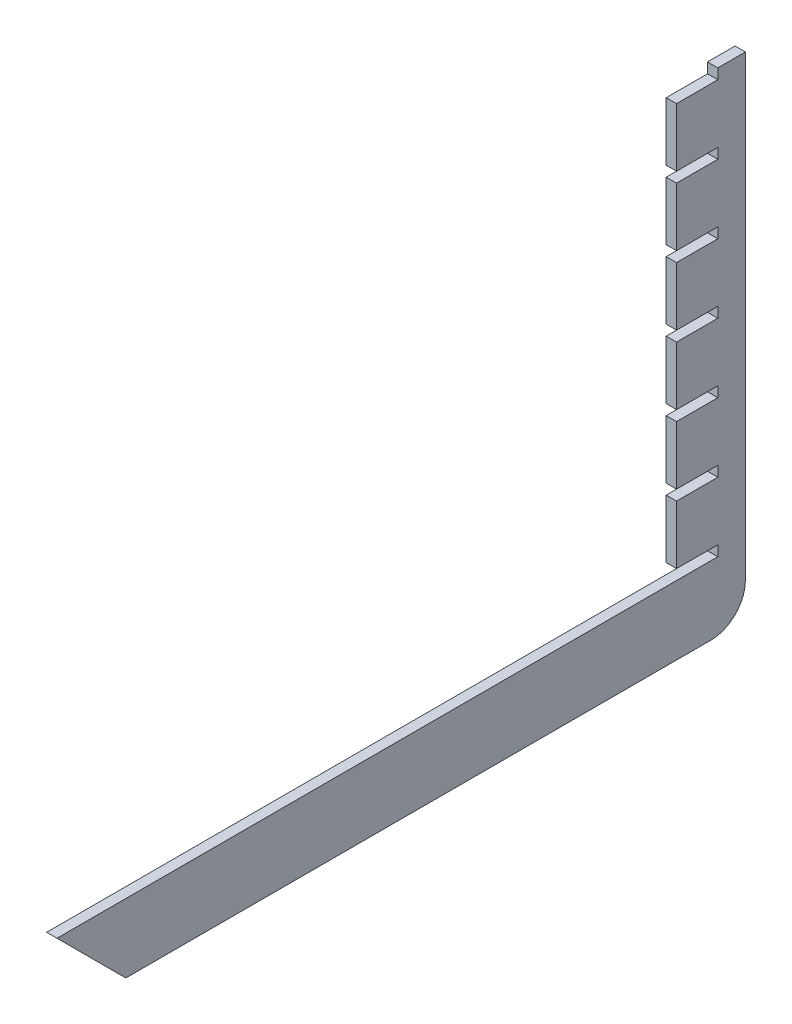
ISO-10303-21;
HEADER;
FILE_DESCRIPTION(('STEP AP214'),'2;1');
FILE_NAME('part.step','',(''),(''),'','','');
FILE_SCHEMA(('AUTOMOTIVE_DESIGN { 1 0 10303 214 1 1 1 1 }'));
ENDSEC;
DATA;
#1=APPLICATION_CONTEXT('core data for automotive mechanical design processes');
#2=APPLICATION_PROTOCOL_DEFINITION('international standard','automotive_design',2000,#1);
#3=PRODUCT_CONTEXT('',#1,'mechanical');
#4=PRODUCT('Part','Part','',(#3));
#5=PRODUCT_RELATED_PRODUCT_CATEGORY('part','',(#4));
#6=PRODUCT_DEFINITION_FORMATION('','',#4);
#7=PRODUCT_DEFINITION_CONTEXT('part definition',#1,'design');
#8=PRODUCT_DEFINITION('design','',#6,#7);
#9=PRODUCT_DEFINITION_SHAPE('','',#8);
#10=(LENGTH_UNIT() NAMED_UNIT(*) SI_UNIT(.MILLI.,.METRE.));
#11=(NAMED_UNIT(*) PLANE_ANGLE_UNIT() SI_UNIT($,.RADIAN.));
#12=(NAMED_UNIT(*) SI_UNIT($,.STERADIAN.) SOLID_ANGLE_UNIT());
#13=UNCERTAINTY_MEASURE_WITH_UNIT(LENGTH_MEASURE(1.E-05),#10,'distance_accuracy_value','');
#14=(GEOMETRIC_REPRESENTATION_CONTEXT(3) GLOBAL_UNCERTAINTY_ASSIGNED_CONTEXT((#13)) GLOBAL_UNIT_ASSIGNED_CONTEXT((#10,
#11,#12)) REPRESENTATION_CONTEXT('',''));
#15=CARTESIAN_POINT('',(0.,0.,0.));
#16=DIRECTION('',(0.,0.,1.));
#17=DIRECTION('',(1.,0.,0.));
#18=AXIS2_PLACEMENT_3D('',#15,#16,#17);
#19=CARTESIAN_POINT('',(3.,0.,0.));
#20=DIRECTION('',(0.,0.,-1.));
#21=DIRECTION('',(-1.,0.,0.));
#22=AXIS2_PLACEMENT_3D('',#19,#20,#21);
#23=PLANE('',#22);
#24=DIRECTION('',(0.,-1.,0.));
#25=VECTOR('',#24,1.);
#26=CARTESIAN_POINT('',(0.,0.,0.));
#27=LINE('',#26,#25);
#28=CARTESIAN_POINT('',(0.,40.,0.));
#29=VERTEX_POINT('',#28);
#30=CARTESIAN_POINT('',(0.,23.,0.));
#31=VERTEX_POINT('',#30);
#32=EDGE_CURVE('E525',#29,#31,#27,.T.);
#33=ORIENTED_EDGE('',*,*,#32,.T.);
#34=DIRECTION('',(1.,0.,0.));
#35=VECTOR('',#34,1.);
#36=CARTESIAN_POINT('',(0.,23.,0.));
#37=LINE('',#36,#35);
#38=CARTESIAN_POINT('',(3.,23.,0.));
#39=VERTEX_POINT('',#38);
#40=EDGE_CURVE('E302',#31,#39,#37,.T.);
#41=ORIENTED_EDGE('',*,*,#40,.T.);
#42=DIRECTION('',(0.,-1.,0.));
#43=VECTOR('',#42,1.);
#44=CARTESIAN_POINT('',(3.,0.,0.));
#45=LINE('',#44,#43);
#46=CARTESIAN_POINT('',(3.,40.,0.));
#47=VERTEX_POINT('',#46);
#48=EDGE_CURVE('E512',#47,#39,#45,.T.);
#49=ORIENTED_EDGE('',*,*,#48,.F.);
#50=DIRECTION('',(1.,0.,0.));
#51=VECTOR('',#50,1.);
#52=CARTESIAN_POINT('',(0.,40.,0.));
#53=LINE('',#52,#51);
#54=EDGE_CURVE('E328',#29,#47,#53,.T.);
#55=ORIENTED_EDGE('',*,*,#54,.F.);
#56=EDGE_LOOP('',(#33,#41,#49,#55));
#57=FACE_BOUND('',#56,.T.);
#58=ADVANCED_FACE('F42',(#57),#23,.F.);
#59=CARTESIAN_POINT('',(0.,60.,0.));
#60=VERTEX_POINT('',#59);
#61=CARTESIAN_POINT('',(0.,43.,0.));
#62=VERTEX_POINT('',#61);
#63=EDGE_CURVE('E564',#60,#62,#27,.T.);
#64=ORIENTED_EDGE('',*,*,#63,.T.);
#65=DIRECTION('',(1.,0.,0.));
#66=VECTOR('',#65,1.);
#67=CARTESIAN_POINT('',(0.,43.,0.));
#68=LINE('',#67,#66);
#69=CARTESIAN_POINT('',(3.,43.,0.));
#70=VERTEX_POINT('',#69);
#71=EDGE_CURVE('E296',#62,#70,#68,.T.);
#72=ORIENTED_EDGE('',*,*,#71,.T.);
#73=CARTESIAN_POINT('',(3.,60.,0.));
#74=VERTEX_POINT('',#73);
#75=EDGE_CURVE('E551',#74,#70,#45,.T.);
#76=ORIENTED_EDGE('',*,*,#75,.F.);
#77=DIRECTION('',(1.,0.,0.));
#78=VECTOR('',#77,1.);
#79=CARTESIAN_POINT('',(0.,60.,0.));
#80=LINE('',#79,#78);
#81=EDGE_CURVE('E364',#60,#74,#80,.T.);
#82=ORIENTED_EDGE('',*,*,#81,.F.);
#83=EDGE_LOOP('',(#64,#72,#76,#82));
#84=FACE_BOUND('',#83,.T.);
#85=ADVANCED_FACE('F617',(#84),#23,.F.);
#86=CARTESIAN_POINT('',(0.,80.,0.));
#87=VERTEX_POINT('',#86);
#88=CARTESIAN_POINT('',(0.,63.,0.));
#89=VERTEX_POINT('',#88);
#90=EDGE_CURVE('E561',#87,#89,#27,.T.);
#91=ORIENTED_EDGE('',*,*,#90,.T.);
#92=DIRECTION('',(1.,0.,0.));
#93=VECTOR('',#92,1.);
#94=CARTESIAN_POINT('',(0.,63.,0.));
#95=LINE('',#94,#93);
#96=CARTESIAN_POINT('',(3.,63.,0.));
#97=VERTEX_POINT('',#96);
#98=EDGE_CURVE('E334',#89,#97,#95,.T.);
#99=ORIENTED_EDGE('',*,*,#98,.T.);
#100=CARTESIAN_POINT('',(3.,80.,0.));
#101=VERTEX_POINT('',#100);
#102=EDGE_CURVE('E548',#101,#97,#45,.T.);
#103=ORIENTED_EDGE('',*,*,#102,.F.);
#104=DIRECTION('',(1.,0.,0.));
#105=VECTOR('',#104,1.);
#106=CARTESIAN_POINT('',(0.,80.,0.));
#107=LINE('',#106,#105);
#108=EDGE_CURVE('E400',#87,#101,#107,.T.);
#109=ORIENTED_EDGE('',*,*,#108,.F.);
#110=EDGE_LOOP('',(#91,#99,#103,#109));
#111=FACE_BOUND('',#110,.T.);
#112=ADVANCED_FACE('F632',(#111),#23,.F.);
#113=CARTESIAN_POINT('',(0.,100.,0.));
#114=VERTEX_POINT('',#113);
#115=CARTESIAN_POINT('',(0.,83.,0.));
#116=VERTEX_POINT('',#115);
#117=EDGE_CURVE('E558',#114,#116,#27,.T.);
#118=ORIENTED_EDGE('',*,*,#117,.T.);
#119=DIRECTION('',(1.,0.,0.));
#120=VECTOR('',#119,1.);
#121=CARTESIAN_POINT('',(0.,83.,0.));
#122=LINE('',#121,#120);
#123=CARTESIAN_POINT('',(3.,83.,0.));
#124=VERTEX_POINT('',#123);
#125=EDGE_CURVE('E370',#116,#124,#122,.T.);
#126=ORIENTED_EDGE('',*,*,#125,.T.);
#127=CARTESIAN_POINT('',(3.,100.,0.));
#128=VERTEX_POINT('',#127);
#129=EDGE_CURVE('E545',#128,#124,#45,.T.);
#130=ORIENTED_EDGE('',*,*,#129,.F.);
#131=DIRECTION('',(1.,0.,0.));
#132=VECTOR('',#131,1.);
#133=CARTESIAN_POINT('',(0.,100.,0.));
#134=LINE('',#133,#132);
#135=EDGE_CURVE('E436',#114,#128,#134,.T.);
#136=ORIENTED_EDGE('',*,*,#135,.F.);
#137=EDGE_LOOP('',(#118,#126,#130,#136));
#138=FACE_BOUND('',#137,.T.);
#139=ADVANCED_FACE('F647',(#138),#23,.F.);
#140=CARTESIAN_POINT('',(0.,120.,0.));
#141=VERTEX_POINT('',#140);
#142=CARTESIAN_POINT('',(0.,103.,0.));
#143=VERTEX_POINT('',#142);
#144=EDGE_CURVE('E526',#141,#143,#27,.T.);
#145=ORIENTED_EDGE('',*,*,#144,.T.);
#146=DIRECTION('',(1.,0.,0.));
#147=VECTOR('',#146,1.);
#148=CARTESIAN_POINT('',(0.,103.,0.));
#149=LINE('',#148,#147);
#150=CARTESIAN_POINT('',(3.,103.,0.));
#151=VERTEX_POINT('',#150);
#152=EDGE_CURVE('E406',#143,#151,#149,.T.);
#153=ORIENTED_EDGE('',*,*,#152,.T.);
#154=CARTESIAN_POINT('',(3.,120.,0.));
#155=VERTEX_POINT('',#154);
#156=EDGE_CURVE('E514',#155,#151,#45,.T.);
#157=ORIENTED_EDGE('',*,*,#156,.F.);
#158=DIRECTION('',(1.,0.,0.));
#159=VECTOR('',#158,1.);
#160=CARTESIAN_POINT('',(0.,120.,0.));
#161=LINE('',#160,#159);
#162=EDGE_CURVE('E468',#141,#155,#161,.T.);
#163=ORIENTED_EDGE('',*,*,#162,.F.);
#164=EDGE_LOOP('',(#145,#153,#157,#163));
#165=FACE_BOUND('',#164,.T.);
#166=ADVANCED_FACE('F662',(#165),#23,.F.);
#167=CARTESIAN_POINT('',(3.,20.,0.));
#168=VERTEX_POINT('',#167);
#169=CARTESIAN_POINT('',(3.,3.,0.));
#170=VERTEX_POINT('',#169);
#171=EDGE_CURVE('E509',#168,#170,#45,.T.);
#172=ORIENTED_EDGE('',*,*,#171,.F.);
#173=DIRECTION('',(1.,0.,0.));
#174=VECTOR('',#173,1.);
#175=CARTESIAN_POINT('',(0.,20.,0.));
#176=LINE('',#175,#174);
#177=CARTESIAN_POINT('',(0.,20.,0.));
#178=VERTEX_POINT('',#177);
#179=EDGE_CURVE('E290',#178,#168,#176,.T.);
#180=ORIENTED_EDGE('',*,*,#179,.F.);
#181=CARTESIAN_POINT('',(0.,3.,0.));
#182=VERTEX_POINT('',#181);
#183=EDGE_CURVE('E502',#178,#182,#27,.T.);
#184=ORIENTED_EDGE('',*,*,#183,.T.);
#185=DIRECTION('',(1.,0.,0.));
#186=VECTOR('',#185,1.);
#187=CARTESIAN_POINT('',(0.,3.,0.));
#188=LINE('',#187,#186);
#189=EDGE_CURVE('E498',#182,#170,#188,.T.);
#190=ORIENTED_EDGE('',*,*,#189,.T.);
#191=EDGE_LOOP('',(#172,#180,#184,#190));
#192=FACE_BOUND('',#191,.T.);
#193=ADVANCED_FACE('F589',(#192),#23,.F.);
#194=CARTESIAN_POINT('',(3.,0.,-20.));
#195=DIRECTION('',(0.,0.,1.));
#196=DIRECTION('',(1.,0.,0.));
#197=AXIS2_PLACEMENT_3D('',#194,#195,#196);
#198=PLANE('',#197);
#199=DIRECTION('',(0.,1.,0.));
#200=VECTOR('',#199,1.);
#201=CARTESIAN_POINT('',(3.,0.,-20.));
#202=LINE('',#201,#200);
#203=CARTESIAN_POINT('',(3.,-10.,-20.));
#204=VERTEX_POINT('',#203);
#205=CARTESIAN_POINT('',(3.,123.,-20.));
#206=VERTEX_POINT('',#205);
#207=EDGE_CURVE('E515',#204,#206,#202,.T.);
#208=ORIENTED_EDGE('',*,*,#207,.F.);
#209=DIRECTION('',(-1.,0.,0.));
#210=VECTOR('',#209,1.);
#211=CARTESIAN_POINT('',(0.,-10.,-20.));
#212=LINE('',#211,#210);
#213=CARTESIAN_POINT('',(0.,-10.,-20.));
#214=VERTEX_POINT('',#213);
#215=EDGE_CURVE('E536',#204,#214,#212,.T.);
#216=ORIENTED_EDGE('',*,*,#215,.T.);
#217=DIRECTION('',(0.,1.,0.));
#218=VECTOR('',#217,1.);
#219=CARTESIAN_POINT('',(0.,0.,-20.));
#220=LINE('',#219,#218);
#221=CARTESIAN_POINT('',(0.,123.,-20.));
#222=VERTEX_POINT('',#221);
#223=EDGE_CURVE('E527',#214,#222,#220,.T.);
#224=ORIENTED_EDGE('',*,*,#223,.T.);
#225=DIRECTION('',(-1.,0.,0.));
#226=VECTOR('',#225,1.);
#227=CARTESIAN_POINT('',(3.,123.,-20.));
#228=LINE('',#227,#226);
#229=EDGE_CURVE('E522',#206,#222,#228,.T.);
#230=ORIENTED_EDGE('',*,*,#229,.F.);
#231=EDGE_LOOP('',(#208,#216,#224,#230));
#232=FACE_BOUND('',#231,.T.);
#233=ADVANCED_FACE('F678',(#232),#198,.F.);
#234=CARTESIAN_POINT('',(3.,123.,0.));
#235=DIRECTION('',(0.,-1.,0.));
#236=DIRECTION('',(0.,0.,-1.));
#237=AXIS2_PLACEMENT_3D('',#234,#235,#236);
#238=PLANE('',#237);
#239=DIRECTION('',(0.,0.,1.));
#240=VECTOR('',#239,1.);
#241=CARTESIAN_POINT('',(0.,123.,0.));
#242=LINE('',#241,#240);
#243=CARTESIAN_POINT('',(0.,123.,-12.));
#244=VERTEX_POINT('',#243);
#245=EDGE_CURVE('E513',#222,#244,#242,.T.);
#246=ORIENTED_EDGE('',*,*,#245,.T.);
#247=DIRECTION('',(1.,0.,0.));
#248=VECTOR('',#247,1.);
#249=CARTESIAN_POINT('',(0.,123.,-12.));
#250=LINE('',#249,#248);
#251=CARTESIAN_POINT('',(3.,123.,-12.));
#252=VERTEX_POINT('',#251);
#253=EDGE_CURVE('E442',#244,#252,#250,.T.);
#254=ORIENTED_EDGE('',*,*,#253,.T.);
#255=DIRECTION('',(0.,0.,1.));
#256=VECTOR('',#255,1.);
#257=CARTESIAN_POINT('',(3.,123.,0.));
#258=LINE('',#257,#256);
#259=EDGE_CURVE('E518',#206,#252,#258,.T.);
#260=ORIENTED_EDGE('',*,*,#259,.F.);
#261=ORIENTED_EDGE('',*,*,#229,.T.);
#262=EDGE_LOOP('',(#246,#254,#260,#261));
#263=FACE_BOUND('',#262,.T.);
#264=ADVANCED_FACE('F673',(#263),#238,.F.);
#265=CARTESIAN_POINT('',(3.,0.,0.));
#266=DIRECTION('',(-1.,0.,0.));
#267=DIRECTION('',(0.,0.,1.));
#268=AXIS2_PLACEMENT_3D('',#265,#266,#267);
#269=PLANE('',#268);
#270=DIRECTION('',(0.,0.,-1.));
#271=VECTOR('',#270,1.);
#272=CARTESIAN_POINT('',(3.,-20.,-20.));
#273=LINE('',#272,#271);
#274=CARTESIAN_POINT('',(3.,-20.,160.));
#275=VERTEX_POINT('',#274);
#276=CARTESIAN_POINT('',(3.,-20.,-10.));
#277=VERTEX_POINT('',#276);
#278=EDGE_CURVE('E255',#275,#277,#273,.T.);
#279=ORIENTED_EDGE('',*,*,#278,.T.);
#280=CARTESIAN_POINT('',(3.,-10.,-10.));
#281=DIRECTION('',(-1.,0.,0.));
#282=DIRECTION('',(0.,0.,1.));
#283=AXIS2_PLACEMENT_3D('',#280,#281,#282);
#284=CIRCLE('',#283,10.);
#285=EDGE_CURVE('E11',#277,#204,#284,.F.);
#286=ORIENTED_EDGE('',*,*,#285,.T.);
#287=ORIENTED_EDGE('',*,*,#207,.T.);
#288=ORIENTED_EDGE('',*,*,#259,.T.);
#289=DIRECTION('',(0.,1.,0.));
#290=VECTOR('',#289,1.);
#291=CARTESIAN_POINT('',(3.,120.,-12.));
#292=LINE('',#291,#290);
#293=CARTESIAN_POINT('',(3.,120.,-12.));
#294=VERTEX_POINT('',#293);
#295=EDGE_CURVE('E464',#294,#252,#292,.T.);
#296=ORIENTED_EDGE('',*,*,#295,.F.);
#297=DIRECTION('',(0.,0.,-1.));
#298=VECTOR('',#297,1.);
#299=CARTESIAN_POINT('',(3.,120.,0.));
#300=LINE('',#299,#298);
#301=EDGE_CURVE('E275',#155,#294,#300,.T.);
#302=ORIENTED_EDGE('',*,*,#301,.F.);
#303=ORIENTED_EDGE('',*,*,#156,.T.);
#304=DIRECTION('',(0.,0.,1.));
#305=VECTOR('',#304,1.);
#306=CARTESIAN_POINT('',(3.,103.,0.));
#307=LINE('',#306,#305);
#308=CARTESIAN_POINT('',(3.,103.,-12.));
#309=VERTEX_POINT('',#308);
#310=EDGE_CURVE('E428',#309,#151,#307,.T.);
#311=ORIENTED_EDGE('',*,*,#310,.F.);
#312=DIRECTION('',(0.,1.,0.));
#313=VECTOR('',#312,1.);
#314=CARTESIAN_POINT('',(3.,100.,-12.));
#315=LINE('',#314,#313);
#316=CARTESIAN_POINT('',(3.,100.,-12.));
#317=VERTEX_POINT('',#316);
#318=EDGE_CURVE('E441',#317,#309,#315,.T.);
#319=ORIENTED_EDGE('',*,*,#318,.F.);
#320=DIRECTION('',(0.,0.,-1.));
#321=VECTOR('',#320,1.);
#322=CARTESIAN_POINT('',(3.,100.,0.));
#323=LINE('',#322,#321);
#324=EDGE_CURVE('E437',#128,#317,#323,.T.);
#325=ORIENTED_EDGE('',*,*,#324,.F.);
#326=ORIENTED_EDGE('',*,*,#129,.T.);
#327=DIRECTION('',(0.,0.,1.));
#328=VECTOR('',#327,1.);
#329=CARTESIAN_POINT('',(3.,83.,0.));
#330=LINE('',#329,#328);
#331=CARTESIAN_POINT('',(3.,83.,-12.));
#332=VERTEX_POINT('',#331);
#333=EDGE_CURVE('E392',#332,#124,#330,.T.);
#334=ORIENTED_EDGE('',*,*,#333,.F.);
#335=DIRECTION('',(0.,1.,0.));
#336=VECTOR('',#335,1.);
#337=CARTESIAN_POINT('',(3.,80.,-12.));
#338=LINE('',#337,#336);
#339=CARTESIAN_POINT('',(3.,80.,-12.));
#340=VERTEX_POINT('',#339);
#341=EDGE_CURVE('E405',#340,#332,#338,.T.);
#342=ORIENTED_EDGE('',*,*,#341,.F.);
#343=DIRECTION('',(0.,0.,-1.));
#344=VECTOR('',#343,1.);
#345=CARTESIAN_POINT('',(3.,80.,0.));
#346=LINE('',#345,#344);
#347=EDGE_CURVE('E401',#101,#340,#346,.T.);
#348=ORIENTED_EDGE('',*,*,#347,.F.);
#349=ORIENTED_EDGE('',*,*,#102,.T.);
#350=DIRECTION('',(0.,0.,1.));
#351=VECTOR('',#350,1.);
#352=CARTESIAN_POINT('',(3.,63.,0.));
#353=LINE('',#352,#351);
#354=CARTESIAN_POINT('',(3.,63.,-12.));
#355=VERTEX_POINT('',#354);
#356=EDGE_CURVE('E356',#355,#97,#353,.T.);
#357=ORIENTED_EDGE('',*,*,#356,.F.);
#358=DIRECTION('',(0.,1.,0.));
#359=VECTOR('',#358,1.);
#360=CARTESIAN_POINT('',(3.,60.,-12.));
#361=LINE('',#360,#359);
#362=CARTESIAN_POINT('',(3.,60.,-12.));
#363=VERTEX_POINT('',#362);
#364=EDGE_CURVE('E369',#363,#355,#361,.T.);
#365=ORIENTED_EDGE('',*,*,#364,.F.);
#366=DIRECTION('',(0.,0.,-1.));
#367=VECTOR('',#366,1.);
#368=CARTESIAN_POINT('',(3.,60.,0.));
#369=LINE('',#368,#367);
#370=EDGE_CURVE('E365',#74,#363,#369,.T.);
#371=ORIENTED_EDGE('',*,*,#370,.F.);
#372=ORIENTED_EDGE('',*,*,#75,.T.);
#373=DIRECTION('',(0.,0.,1.));
#374=VECTOR('',#373,1.);
#375=CARTESIAN_POINT('',(3.,43.,0.));
#376=LINE('',#375,#374);
#377=CARTESIAN_POINT('',(3.,43.,-12.));
#378=VERTEX_POINT('',#377);
#379=EDGE_CURVE('E320',#378,#70,#376,.T.);
#380=ORIENTED_EDGE('',*,*,#379,.F.);
#381=DIRECTION('',(0.,1.,0.));
#382=VECTOR('',#381,1.);
#383=CARTESIAN_POINT('',(3.,40.,-12.));
#384=LINE('',#383,#382);
#385=CARTESIAN_POINT('',(3.,40.,-12.));
#386=VERTEX_POINT('',#385);
#387=EDGE_CURVE('E333',#386,#378,#384,.T.);
#388=ORIENTED_EDGE('',*,*,#387,.F.);
#389=DIRECTION('',(0.,0.,-1.));
#390=VECTOR('',#389,1.);
#391=CARTESIAN_POINT('',(3.,40.,0.));
#392=LINE('',#391,#390);
#393=EDGE_CURVE('E329',#47,#386,#392,.T.);
#394=ORIENTED_EDGE('',*,*,#393,.F.);
#395=ORIENTED_EDGE('',*,*,#48,.T.);
#396=DIRECTION('',(0.,0.,1.));
#397=VECTOR('',#396,1.);
#398=CARTESIAN_POINT('',(3.,23.,0.));
#399=LINE('',#398,#397);
#400=CARTESIAN_POINT('',(3.,23.,-12.));
#401=VERTEX_POINT('',#400);
#402=EDGE_CURVE('E282',#401,#39,#399,.T.);
#403=ORIENTED_EDGE('',*,*,#402,.F.);
#404=DIRECTION('',(0.,1.,0.));
#405=VECTOR('',#404,1.);
#406=CARTESIAN_POINT('',(3.,20.,-12.));
#407=LINE('',#406,#405);
#408=CARTESIAN_POINT('',(3.,20.,-12.));
#409=VERTEX_POINT('',#408);
#410=EDGE_CURVE('E295',#409,#401,#407,.T.);
#411=ORIENTED_EDGE('',*,*,#410,.F.);
#412=DIRECTION('',(0.,0.,-1.));
#413=VECTOR('',#412,1.);
#414=CARTESIAN_POINT('',(3.,20.,0.));
#415=LINE('',#414,#413);
#416=EDGE_CURVE('E291',#168,#409,#415,.T.);
#417=ORIENTED_EDGE('',*,*,#416,.F.);
#418=ORIENTED_EDGE('',*,*,#171,.T.);
#419=DIRECTION('',(0.,0.,1.));
#420=VECTOR('',#419,1.);
#421=CARTESIAN_POINT('',(3.,3.,0.));
#422=LINE('',#421,#420);
#423=CARTESIAN_POINT('',(3.,3.,-12.));
#424=VERTEX_POINT('',#423);
#425=EDGE_CURVE('E487',#424,#170,#422,.T.);
#426=ORIENTED_EDGE('',*,*,#425,.F.);
#427=DIRECTION('',(0.,1.,0.));
#428=VECTOR('',#427,1.);
#429=CARTESIAN_POINT('',(3.,0.,-12.));
#430=LINE('',#429,#428);
#431=CARTESIAN_POINT('',(3.,0.,-12.));
#432=VERTEX_POINT('',#431);
#433=EDGE_CURVE('E306',#432,#424,#430,.T.);
#434=ORIENTED_EDGE('',*,*,#433,.F.);
#435=DIRECTION('',(0.,0.,1.));
#436=VECTOR('',#435,1.);
#437=CARTESIAN_POINT('',(3.,0.,-20.));
#438=LINE('',#437,#436);
#439=CARTESIAN_POINT('',(3.,0.,180.));
#440=VERTEX_POINT('',#439);
#441=EDGE_CURVE('E276',#432,#440,#438,.T.);
#442=ORIENTED_EDGE('',*,*,#441,.T.);
#443=DIRECTION('',(0.,-0.707106781186544,-0.707106781186551));
#444=VECTOR('',#443,1.);
#445=CARTESIAN_POINT('',(3.,0.,180.));
#446=LINE('',#445,#444);
#447=EDGE_CURVE('E271',#440,#275,#446,.T.);
#448=ORIENTED_EDGE('',*,*,#447,.T.);
#449=EDGE_LOOP('',(#279,#286,#287,#288,#296,#302,#303,#311,#319,#325,#326,#334,#342,#348,#349,
#357,#365,#371,#372,#380,#388,#394,#395,#403,#411,#417,#418,#426,#434,#442,#448));
#450=FACE_BOUND('',#449,.T.);
#451=ADVANCED_FACE('F572',(#450),#269,.F.);
#452=CARTESIAN_POINT('',(0.,0.,0.));
#453=DIRECTION('',(-1.,0.,0.));
#454=DIRECTION('',(0.,0.,1.));
#455=AXIS2_PLACEMENT_3D('',#452,#453,#454);
#456=PLANE('',#455);
#457=ORIENTED_EDGE('',*,*,#223,.F.);
#458=CARTESIAN_POINT('',(0.,-10.,-10.));
#459=DIRECTION('',(-1.,0.,0.));
#460=DIRECTION('',(0.,0.,1.));
#461=AXIS2_PLACEMENT_3D('',#458,#459,#460);
#462=CIRCLE('',#461,10.);
#463=CARTESIAN_POINT('',(0.,-20.,-10.));
#464=VERTEX_POINT('',#463);
#465=EDGE_CURVE('E65',#214,#464,#462,.T.);
#466=ORIENTED_EDGE('',*,*,#465,.T.);
#467=DIRECTION('',(0.,0.,1.));
#468=VECTOR('',#467,1.);
#469=CARTESIAN_POINT('',(0.,-20.,-20.));
#470=LINE('',#469,#468);
#471=CARTESIAN_POINT('',(0.,-20.,160.));
#472=VERTEX_POINT('',#471);
#473=EDGE_CURVE('E243',#464,#472,#470,.T.);
#474=ORIENTED_EDGE('',*,*,#473,.T.);
#475=DIRECTION('',(0.,0.707106781186544,0.707106781186551));
#476=VECTOR('',#475,1.);
#477=CARTESIAN_POINT('',(0.,0.,180.));
#478=LINE('',#477,#476);
#479=CARTESIAN_POINT('',(0.,0.,180.));
#480=VERTEX_POINT('',#479);
#481=EDGE_CURVE('E248',#472,#480,#478,.T.);
#482=ORIENTED_EDGE('',*,*,#481,.T.);
#483=DIRECTION('',(0.,0.,-1.));
#484=VECTOR('',#483,1.);
#485=CARTESIAN_POINT('',(0.,0.,-20.));
#486=LINE('',#485,#484);
#487=CARTESIAN_POINT('',(0.,0.,-12.));
#488=VERTEX_POINT('',#487);
#489=EDGE_CURVE('E260',#480,#488,#486,.T.);
#490=ORIENTED_EDGE('',*,*,#489,.T.);
#491=DIRECTION('',(0.,1.,0.));
#492=VECTOR('',#491,1.);
#493=CARTESIAN_POINT('',(0.,0.,-12.));
#494=LINE('',#493,#492);
#495=CARTESIAN_POINT('',(0.,3.,-12.));
#496=VERTEX_POINT('',#495);
#497=EDGE_CURVE('E482',#488,#496,#494,.T.);
#498=ORIENTED_EDGE('',*,*,#497,.T.);
#499=DIRECTION('',(0.,0.,1.));
#500=VECTOR('',#499,1.);
#501=CARTESIAN_POINT('',(0.,3.,0.));
#502=LINE('',#501,#500);
#503=EDGE_CURVE('E486',#496,#182,#502,.T.);
#504=ORIENTED_EDGE('',*,*,#503,.T.);
#505=ORIENTED_EDGE('',*,*,#183,.F.);
#506=DIRECTION('',(0.,0.,-1.));
#507=VECTOR('',#506,1.);
#508=CARTESIAN_POINT('',(0.,20.,0.));
#509=LINE('',#508,#507);
#510=CARTESIAN_POINT('',(0.,20.,-12.));
#511=VERTEX_POINT('',#510);
#512=EDGE_CURVE('E277',#178,#511,#509,.T.);
#513=ORIENTED_EDGE('',*,*,#512,.T.);
#514=DIRECTION('',(0.,1.,0.));
#515=VECTOR('',#514,1.);
#516=CARTESIAN_POINT('',(0.,20.,-12.));
#517=LINE('',#516,#515);
#518=CARTESIAN_POINT('',(0.,23.,-12.));
#519=VERTEX_POINT('',#518);
#520=EDGE_CURVE('E281',#511,#519,#517,.T.);
#521=ORIENTED_EDGE('',*,*,#520,.T.);
#522=DIRECTION('',(0.,0.,1.));
#523=VECTOR('',#522,1.);
#524=CARTESIAN_POINT('',(0.,23.,0.));
#525=LINE('',#524,#523);
#526=EDGE_CURVE('E286',#519,#31,#525,.T.);
#527=ORIENTED_EDGE('',*,*,#526,.T.);
#528=ORIENTED_EDGE('',*,*,#32,.F.);
#529=DIRECTION('',(0.,0.,-1.));
#530=VECTOR('',#529,1.);
#531=CARTESIAN_POINT('',(0.,40.,0.));
#532=LINE('',#531,#530);
#533=CARTESIAN_POINT('',(0.,40.,-12.));
#534=VERTEX_POINT('',#533);
#535=EDGE_CURVE('E315',#29,#534,#532,.T.);
#536=ORIENTED_EDGE('',*,*,#535,.T.);
#537=DIRECTION('',(0.,1.,0.));
#538=VECTOR('',#537,1.);
#539=CARTESIAN_POINT('',(0.,40.,-12.));
#540=LINE('',#539,#538);
#541=CARTESIAN_POINT('',(0.,43.,-12.));
#542=VERTEX_POINT('',#541);
#543=EDGE_CURVE('E319',#534,#542,#540,.T.);
#544=ORIENTED_EDGE('',*,*,#543,.T.);
#545=DIRECTION('',(0.,0.,1.));
#546=VECTOR('',#545,1.);
#547=CARTESIAN_POINT('',(0.,43.,0.));
#548=LINE('',#547,#546);
#549=EDGE_CURVE('E324',#542,#62,#548,.T.);
#550=ORIENTED_EDGE('',*,*,#549,.T.);
#551=ORIENTED_EDGE('',*,*,#63,.F.);
#552=DIRECTION('',(0.,0.,-1.));
#553=VECTOR('',#552,1.);
#554=CARTESIAN_POINT('',(0.,60.,0.));
#555=LINE('',#554,#553);
#556=CARTESIAN_POINT('',(0.,60.,-12.));
#557=VERTEX_POINT('',#556);
#558=EDGE_CURVE('E351',#60,#557,#555,.T.);
#559=ORIENTED_EDGE('',*,*,#558,.T.);
#560=DIRECTION('',(0.,1.,0.));
#561=VECTOR('',#560,1.);
#562=CARTESIAN_POINT('',(0.,60.,-12.));
#563=LINE('',#562,#561);
#564=CARTESIAN_POINT('',(0.,63.,-12.));
#565=VERTEX_POINT('',#564);
#566=EDGE_CURVE('E355',#557,#565,#563,.T.);
#567=ORIENTED_EDGE('',*,*,#566,.T.);
#568=DIRECTION('',(0.,0.,1.));
#569=VECTOR('',#568,1.);
#570=CARTESIAN_POINT('',(0.,63.,0.));
#571=LINE('',#570,#569);
#572=EDGE_CURVE('E360',#565,#89,#571,.T.);
#573=ORIENTED_EDGE('',*,*,#572,.T.);
#574=ORIENTED_EDGE('',*,*,#90,.F.);
#575=DIRECTION('',(0.,0.,-1.));
#576=VECTOR('',#575,1.);
#577=CARTESIAN_POINT('',(0.,80.,0.));
#578=LINE('',#577,#576);
#579=CARTESIAN_POINT('',(0.,80.,-12.));
#580=VERTEX_POINT('',#579);
#581=EDGE_CURVE('E387',#87,#580,#578,.T.);
#582=ORIENTED_EDGE('',*,*,#581,.T.);
#583=DIRECTION('',(0.,1.,0.));
#584=VECTOR('',#583,1.);
#585=CARTESIAN_POINT('',(0.,80.,-12.));
#586=LINE('',#585,#584);
#587=CARTESIAN_POINT('',(0.,83.,-12.));
#588=VERTEX_POINT('',#587);
#589=EDGE_CURVE('E391',#580,#588,#586,.T.);
#590=ORIENTED_EDGE('',*,*,#589,.T.);
#591=DIRECTION('',(0.,0.,1.));
#592=VECTOR('',#591,1.);
#593=CARTESIAN_POINT('',(0.,83.,0.));
#594=LINE('',#593,#592);
#595=EDGE_CURVE('E396',#588,#116,#594,.T.);
#596=ORIENTED_EDGE('',*,*,#595,.T.);
#597=ORIENTED_EDGE('',*,*,#117,.F.);
#598=DIRECTION('',(0.,0.,-1.));
#599=VECTOR('',#598,1.);
#600=CARTESIAN_POINT('',(0.,100.,0.));
#601=LINE('',#600,#599);
#602=CARTESIAN_POINT('',(0.,100.,-12.));
#603=VERTEX_POINT('',#602);
#604=EDGE_CURVE('E423',#114,#603,#601,.T.);
#605=ORIENTED_EDGE('',*,*,#604,.T.);
#606=DIRECTION('',(0.,1.,0.));
#607=VECTOR('',#606,1.);
#608=CARTESIAN_POINT('',(0.,100.,-12.));
#609=LINE('',#608,#607);
#610=CARTESIAN_POINT('',(0.,103.,-12.));
#611=VERTEX_POINT('',#610);
#612=EDGE_CURVE('E427',#603,#611,#609,.T.);
#613=ORIENTED_EDGE('',*,*,#612,.T.);
#614=DIRECTION('',(0.,0.,1.));
#615=VECTOR('',#614,1.);
#616=CARTESIAN_POINT('',(0.,103.,0.));
#617=LINE('',#616,#615);
#618=EDGE_CURVE('E432',#611,#143,#617,.T.);
#619=ORIENTED_EDGE('',*,*,#618,.T.);
#620=ORIENTED_EDGE('',*,*,#144,.F.);
#621=DIRECTION('',(0.,0.,-1.));
#622=VECTOR('',#621,1.);
#623=CARTESIAN_POINT('',(0.,120.,0.));
#624=LINE('',#623,#622);
#625=CARTESIAN_POINT('',(0.,120.,-12.));
#626=VERTEX_POINT('',#625);
#627=EDGE_CURVE('E459',#141,#626,#624,.T.);
#628=ORIENTED_EDGE('',*,*,#627,.T.);
#629=DIRECTION('',(0.,1.,0.));
#630=VECTOR('',#629,1.);
#631=CARTESIAN_POINT('',(0.,120.,-12.));
#632=LINE('',#631,#630);
#633=EDGE_CURVE('E463',#626,#244,#632,.T.);
#634=ORIENTED_EDGE('',*,*,#633,.T.);
#635=ORIENTED_EDGE('',*,*,#245,.F.);
#636=EDGE_LOOP('',(#457,#466,#474,#482,#490,#498,#504,#505,#513,#521,#527,#528,#536,#544,#550,
#551,#559,#567,#573,#574,#582,#590,#596,#597,#605,#613,#619,#620,#628,#634,#635));
#637=FACE_BOUND('',#636,.T.);
#638=ADVANCED_FACE('F245',(#637),#456,.T.);
#639=CARTESIAN_POINT('',(0.,3.,0.));
#640=DIRECTION('',(0.,1.,0.));
#641=DIRECTION('',(0.,0.,1.));
#642=AXIS2_PLACEMENT_3D('',#639,#640,#641);
#643=PLANE('',#642);
#644=ORIENTED_EDGE('',*,*,#425,.T.);
#645=ORIENTED_EDGE('',*,*,#189,.F.);
#646=ORIENTED_EDGE('',*,*,#503,.F.);
#647=DIRECTION('',(1.,0.,0.));
#648=VECTOR('',#647,1.);
#649=CARTESIAN_POINT('',(0.,3.,-12.));
#650=LINE('',#649,#648);
#651=EDGE_CURVE('E503',#496,#424,#650,.T.);
#652=ORIENTED_EDGE('',*,*,#651,.T.);
#653=EDGE_LOOP('',(#644,#645,#646,#652));
#654=FACE_BOUND('',#653,.T.);
#655=ADVANCED_FACE('F583',(#654),#643,.F.);
#656=CARTESIAN_POINT('',(0.,0.,-12.));
#657=DIRECTION('',(0.,0.,-1.));
#658=DIRECTION('',(-1.,0.,0.));
#659=AXIS2_PLACEMENT_3D('',#656,#657,#658);
#660=PLANE('',#659);
#661=ORIENTED_EDGE('',*,*,#433,.T.);
#662=ORIENTED_EDGE('',*,*,#651,.F.);
#663=ORIENTED_EDGE('',*,*,#497,.F.);
#664=DIRECTION('',(1.,0.,0.));
#665=VECTOR('',#664,1.);
#666=CARTESIAN_POINT('',(0.,0.,-12.));
#667=LINE('',#666,#665);
#668=EDGE_CURVE('E491',#488,#432,#667,.T.);
#669=ORIENTED_EDGE('',*,*,#668,.T.);
#670=EDGE_LOOP('',(#661,#662,#663,#669));
#671=FACE_BOUND('',#670,.T.);
#672=ADVANCED_FACE('F580',(#671),#660,.F.);
#673=CARTESIAN_POINT('',(0.,120.,-12.));
#674=DIRECTION('',(0.,0.,-1.));
#675=DIRECTION('',(-1.,0.,0.));
#676=AXIS2_PLACEMENT_3D('',#673,#674,#675);
#677=PLANE('',#676);
#678=ORIENTED_EDGE('',*,*,#295,.T.);
#679=ORIENTED_EDGE('',*,*,#253,.F.);
#680=ORIENTED_EDGE('',*,*,#633,.F.);
#681=DIRECTION('',(1.,0.,0.));
#682=VECTOR('',#681,1.);
#683=CARTESIAN_POINT('',(0.,120.,-12.));
#684=LINE('',#683,#682);
#685=EDGE_CURVE('E477',#626,#294,#684,.T.);
#686=ORIENTED_EDGE('',*,*,#685,.T.);
#687=EDGE_LOOP('',(#678,#679,#680,#686));
#688=FACE_BOUND('',#687,.T.);
#689=ADVANCED_FACE('F671',(#688),#677,.F.);
#690=CARTESIAN_POINT('',(0.,120.,0.));
#691=DIRECTION('',(0.,-1.,0.));
#692=DIRECTION('',(0.,0.,-1.));
#693=AXIS2_PLACEMENT_3D('',#690,#691,#692);
#694=PLANE('',#693);
#695=ORIENTED_EDGE('',*,*,#301,.T.);
#696=ORIENTED_EDGE('',*,*,#685,.F.);
#697=ORIENTED_EDGE('',*,*,#627,.F.);
#698=ORIENTED_EDGE('',*,*,#162,.T.);
#699=EDGE_LOOP('',(#695,#696,#697,#698));
#700=FACE_BOUND('',#699,.T.);
#701=ADVANCED_FACE('F666',(#700),#694,.F.);
#702=CARTESIAN_POINT('',(0.,103.,0.));
#703=DIRECTION('',(0.,1.,0.));
#704=DIRECTION('',(0.,0.,1.));
#705=AXIS2_PLACEMENT_3D('',#702,#703,#704);
#706=PLANE('',#705);
#707=ORIENTED_EDGE('',*,*,#310,.T.);
#708=ORIENTED_EDGE('',*,*,#152,.F.);
#709=ORIENTED_EDGE('',*,*,#618,.F.);
#710=DIRECTION('',(1.,0.,0.));
#711=VECTOR('',#710,1.);
#712=CARTESIAN_POINT('',(0.,103.,-12.));
#713=LINE('',#712,#711);
#714=EDGE_CURVE('E451',#611,#309,#713,.T.);
#715=ORIENTED_EDGE('',*,*,#714,.T.);
#716=EDGE_LOOP('',(#707,#708,#709,#715));
#717=FACE_BOUND('',#716,.T.);
#718=ADVANCED_FACE('F753',(#717),#706,.F.);
#719=CARTESIAN_POINT('',(0.,100.,-12.));
#720=DIRECTION('',(0.,0.,-1.));
#721=DIRECTION('',(-1.,0.,0.));
#722=AXIS2_PLACEMENT_3D('',#719,#720,#721);
#723=PLANE('',#722);
#724=ORIENTED_EDGE('',*,*,#318,.T.);
#725=ORIENTED_EDGE('',*,*,#714,.F.);
#726=ORIENTED_EDGE('',*,*,#612,.F.);
#727=DIRECTION('',(1.,0.,0.));
#728=VECTOR('',#727,1.);
#729=CARTESIAN_POINT('',(0.,100.,-12.));
#730=LINE('',#729,#728);
#731=EDGE_CURVE('E454',#603,#317,#730,.T.);
#732=ORIENTED_EDGE('',*,*,#731,.T.);
#733=EDGE_LOOP('',(#724,#725,#726,#732));
#734=FACE_BOUND('',#733,.T.);
#735=ADVANCED_FACE('F656',(#734),#723,.F.);
#736=CARTESIAN_POINT('',(0.,100.,0.));
#737=DIRECTION('',(0.,-1.,0.));
#738=DIRECTION('',(0.,0.,-1.));
#739=AXIS2_PLACEMENT_3D('',#736,#737,#738);
#740=PLANE('',#739);
#741=ORIENTED_EDGE('',*,*,#324,.T.);
#742=ORIENTED_EDGE('',*,*,#731,.F.);
#743=ORIENTED_EDGE('',*,*,#604,.F.);
#744=ORIENTED_EDGE('',*,*,#135,.T.);
#745=EDGE_LOOP('',(#741,#742,#743,#744));
#746=FACE_BOUND('',#745,.T.);
#747=ADVANCED_FACE('F651',(#746),#740,.F.);
#748=CARTESIAN_POINT('',(0.,83.,0.));
#749=DIRECTION('',(0.,1.,0.));
#750=DIRECTION('',(0.,0.,1.));
#751=AXIS2_PLACEMENT_3D('',#748,#749,#750);
#752=PLANE('',#751);
#753=ORIENTED_EDGE('',*,*,#333,.T.);
#754=ORIENTED_EDGE('',*,*,#125,.F.);
#755=ORIENTED_EDGE('',*,*,#595,.F.);
#756=DIRECTION('',(1.,0.,0.));
#757=VECTOR('',#756,1.);
#758=CARTESIAN_POINT('',(0.,83.,-12.));
#759=LINE('',#758,#757);
#760=EDGE_CURVE('E415',#588,#332,#759,.T.);
#761=ORIENTED_EDGE('',*,*,#760,.T.);
#762=EDGE_LOOP('',(#753,#754,#755,#761));
#763=FACE_BOUND('',#762,.T.);
#764=ADVANCED_FACE('F772',(#763),#752,.F.);
#765=CARTESIAN_POINT('',(0.,80.,-12.));
#766=DIRECTION('',(0.,0.,-1.));
#767=DIRECTION('',(-1.,0.,0.));
#768=AXIS2_PLACEMENT_3D('',#765,#766,#767);
#769=PLANE('',#768);
#770=ORIENTED_EDGE('',*,*,#341,.T.);
#771=ORIENTED_EDGE('',*,*,#760,.F.);
#772=ORIENTED_EDGE('',*,*,#589,.F.);
#773=DIRECTION('',(1.,0.,0.));
#774=VECTOR('',#773,1.);
#775=CARTESIAN_POINT('',(0.,80.,-12.));
#776=LINE('',#775,#774);
#777=EDGE_CURVE('E418',#580,#340,#776,.T.);
#778=ORIENTED_EDGE('',*,*,#777,.T.);
#779=EDGE_LOOP('',(#770,#771,#772,#778));
#780=FACE_BOUND('',#779,.T.);
#781=ADVANCED_FACE('F641',(#780),#769,.F.);
#782=CARTESIAN_POINT('',(0.,80.,0.));
#783=DIRECTION('',(0.,-1.,0.));
#784=DIRECTION('',(0.,0.,-1.));
#785=AXIS2_PLACEMENT_3D('',#782,#783,#784);
#786=PLANE('',#785);
#787=ORIENTED_EDGE('',*,*,#347,.T.);
#788=ORIENTED_EDGE('',*,*,#777,.F.);
#789=ORIENTED_EDGE('',*,*,#581,.F.);
#790=ORIENTED_EDGE('',*,*,#108,.T.);
#791=EDGE_LOOP('',(#787,#788,#789,#790));
#792=FACE_BOUND('',#791,.T.);
#793=ADVANCED_FACE('F636',(#792),#786,.F.);
#794=CARTESIAN_POINT('',(0.,63.,0.));
#795=DIRECTION('',(0.,1.,0.));
#796=DIRECTION('',(0.,0.,1.));
#797=AXIS2_PLACEMENT_3D('',#794,#795,#796);
#798=PLANE('',#797);
#799=ORIENTED_EDGE('',*,*,#356,.T.);
#800=ORIENTED_EDGE('',*,*,#98,.F.);
#801=ORIENTED_EDGE('',*,*,#572,.F.);
#802=DIRECTION('',(1.,0.,0.));
#803=VECTOR('',#802,1.);
#804=CARTESIAN_POINT('',(0.,63.,-12.));
#805=LINE('',#804,#803);
#806=EDGE_CURVE('E379',#565,#355,#805,.T.);
#807=ORIENTED_EDGE('',*,*,#806,.T.);
#808=EDGE_LOOP('',(#799,#800,#801,#807));
#809=FACE_BOUND('',#808,.T.);
#810=ADVANCED_FACE('F791',(#809),#798,.F.);
#811=CARTESIAN_POINT('',(0.,60.,-12.));
#812=DIRECTION('',(0.,0.,-1.));
#813=DIRECTION('',(-1.,0.,0.));
#814=AXIS2_PLACEMENT_3D('',#811,#812,#813);
#815=PLANE('',#814);
#816=ORIENTED_EDGE('',*,*,#364,.T.);
#817=ORIENTED_EDGE('',*,*,#806,.F.);
#818=ORIENTED_EDGE('',*,*,#566,.F.);
#819=DIRECTION('',(1.,0.,0.));
#820=VECTOR('',#819,1.);
#821=CARTESIAN_POINT('',(0.,60.,-12.));
#822=LINE('',#821,#820);
#823=EDGE_CURVE('E382',#557,#363,#822,.T.);
#824=ORIENTED_EDGE('',*,*,#823,.T.);
#825=EDGE_LOOP('',(#816,#817,#818,#824));
#826=FACE_BOUND('',#825,.T.);
#827=ADVANCED_FACE('F626',(#826),#815,.F.);
#828=CARTESIAN_POINT('',(0.,60.,0.));
#829=DIRECTION('',(0.,-1.,0.));
#830=DIRECTION('',(0.,0.,-1.));
#831=AXIS2_PLACEMENT_3D('',#828,#829,#830);
#832=PLANE('',#831);
#833=ORIENTED_EDGE('',*,*,#370,.T.);
#834=ORIENTED_EDGE('',*,*,#823,.F.);
#835=ORIENTED_EDGE('',*,*,#558,.F.);
#836=ORIENTED_EDGE('',*,*,#81,.T.);
#837=EDGE_LOOP('',(#833,#834,#835,#836));
#838=FACE_BOUND('',#837,.T.);
#839=ADVANCED_FACE('F621',(#838),#832,.F.);
#840=CARTESIAN_POINT('',(0.,43.,0.));
#841=DIRECTION('',(0.,1.,0.));
#842=DIRECTION('',(0.,0.,1.));
#843=AXIS2_PLACEMENT_3D('',#840,#841,#842);
#844=PLANE('',#843);
#845=ORIENTED_EDGE('',*,*,#379,.T.);
#846=ORIENTED_EDGE('',*,*,#71,.F.);
#847=ORIENTED_EDGE('',*,*,#549,.F.);
#848=DIRECTION('',(1.,0.,0.));
#849=VECTOR('',#848,1.);
#850=CARTESIAN_POINT('',(0.,43.,-12.));
#851=LINE('',#850,#849);
#852=EDGE_CURVE('E343',#542,#378,#851,.T.);
#853=ORIENTED_EDGE('',*,*,#852,.T.);
#854=EDGE_LOOP('',(#845,#846,#847,#853));
#855=FACE_BOUND('',#854,.T.);
#856=ADVANCED_FACE('F810',(#855),#844,.F.);
#857=CARTESIAN_POINT('',(0.,40.,-12.));
#858=DIRECTION('',(0.,0.,-1.));
#859=DIRECTION('',(-1.,0.,0.));
#860=AXIS2_PLACEMENT_3D('',#857,#858,#859);
#861=PLANE('',#860);
#862=ORIENTED_EDGE('',*,*,#387,.T.);
#863=ORIENTED_EDGE('',*,*,#852,.F.);
#864=ORIENTED_EDGE('',*,*,#543,.F.);
#865=DIRECTION('',(1.,0.,0.));
#866=VECTOR('',#865,1.);
#867=CARTESIAN_POINT('',(0.,40.,-12.));
#868=LINE('',#867,#866);
#869=EDGE_CURVE('E346',#534,#386,#868,.T.);
#870=ORIENTED_EDGE('',*,*,#869,.T.);
#871=EDGE_LOOP('',(#862,#863,#864,#870));
#872=FACE_BOUND('',#871,.T.);
#873=ADVANCED_FACE('F611',(#872),#861,.F.);
#874=CARTESIAN_POINT('',(0.,40.,0.));
#875=DIRECTION('',(0.,-1.,0.));
#876=DIRECTION('',(0.,0.,-1.));
#877=AXIS2_PLACEMENT_3D('',#874,#875,#876);
#878=PLANE('',#877);
#879=ORIENTED_EDGE('',*,*,#393,.T.);
#880=ORIENTED_EDGE('',*,*,#869,.F.);
#881=ORIENTED_EDGE('',*,*,#535,.F.);
#882=ORIENTED_EDGE('',*,*,#54,.T.);
#883=EDGE_LOOP('',(#879,#880,#881,#882));
#884=FACE_BOUND('',#883,.T.);
#885=ADVANCED_FACE('F606',(#884),#878,.F.);
#886=CARTESIAN_POINT('',(0.,23.,0.));
#887=DIRECTION('',(0.,1.,0.));
#888=DIRECTION('',(0.,0.,1.));
#889=AXIS2_PLACEMENT_3D('',#886,#887,#888);
#890=PLANE('',#889);
#891=ORIENTED_EDGE('',*,*,#402,.T.);
#892=ORIENTED_EDGE('',*,*,#40,.F.);
#893=ORIENTED_EDGE('',*,*,#526,.F.);
#894=DIRECTION('',(1.,0.,0.));
#895=VECTOR('',#894,1.);
#896=CARTESIAN_POINT('',(0.,23.,-12.));
#897=LINE('',#896,#895);
#898=EDGE_CURVE('E307',#519,#401,#897,.T.);
#899=ORIENTED_EDGE('',*,*,#898,.T.);
#900=EDGE_LOOP('',(#891,#892,#893,#899));
#901=FACE_BOUND('',#900,.T.);
#902=ADVANCED_FACE('F829',(#901),#890,.F.);
#903=CARTESIAN_POINT('',(0.,20.,-12.));
#904=DIRECTION('',(0.,0.,-1.));
#905=DIRECTION('',(-1.,0.,0.));
#906=AXIS2_PLACEMENT_3D('',#903,#904,#905);
#907=PLANE('',#906);
#908=ORIENTED_EDGE('',*,*,#410,.T.);
#909=ORIENTED_EDGE('',*,*,#898,.F.);
#910=ORIENTED_EDGE('',*,*,#520,.F.);
#911=DIRECTION('',(1.,0.,0.));
#912=VECTOR('',#911,1.);
#913=CARTESIAN_POINT('',(0.,20.,-12.));
#914=LINE('',#913,#912);
#915=EDGE_CURVE('E310',#511,#409,#914,.T.);
#916=ORIENTED_EDGE('',*,*,#915,.T.);
#917=EDGE_LOOP('',(#908,#909,#910,#916));
#918=FACE_BOUND('',#917,.T.);
#919=ADVANCED_FACE('F597',(#918),#907,.F.);
#920=CARTESIAN_POINT('',(0.,20.,0.));
#921=DIRECTION('',(0.,-1.,0.));
#922=DIRECTION('',(0.,0.,-1.));
#923=AXIS2_PLACEMENT_3D('',#920,#921,#922);
#924=PLANE('',#923);
#925=ORIENTED_EDGE('',*,*,#416,.T.);
#926=ORIENTED_EDGE('',*,*,#915,.F.);
#927=ORIENTED_EDGE('',*,*,#512,.F.);
#928=ORIENTED_EDGE('',*,*,#179,.T.);
#929=EDGE_LOOP('',(#925,#926,#927,#928));
#930=FACE_BOUND('',#929,.T.);
#931=ADVANCED_FACE('F592',(#930),#924,.F.);
#932=CARTESIAN_POINT('',(203.997512422418,0.,-20.));
#933=DIRECTION('',(0.,1.,0.));
#934=DIRECTION('',(0.,0.,1.));
#935=AXIS2_PLACEMENT_3D('',#932,#933,#934);
#936=PLANE('',#935);
#937=ORIENTED_EDGE('',*,*,#668,.F.);
#938=ORIENTED_EDGE('',*,*,#489,.F.);
#939=DIRECTION('',(-1.,0.,0.));
#940=VECTOR('',#939,1.);
#941=CARTESIAN_POINT('',(203.997512422418,0.,180.));
#942=LINE('',#941,#940);
#943=EDGE_CURVE('E259',#440,#480,#942,.T.);
#944=ORIENTED_EDGE('',*,*,#943,.F.);
#945=ORIENTED_EDGE('',*,*,#441,.F.);
#946=EDGE_LOOP('',(#937,#938,#944,#945));
#947=FACE_BOUND('',#946,.T.);
#948=ADVANCED_FACE('F576',(#947),#936,.T.);
#949=CARTESIAN_POINT('',(203.997512422418,0.,180.));
#950=DIRECTION('',(0.,-0.707106781186551,0.707106781186544));
#951=DIRECTION('',(0.,-0.707106781186544,-0.707106781186551));
#952=AXIS2_PLACEMENT_3D('',#949,#950,#951);
#953=PLANE('',#952);
#954=ORIENTED_EDGE('',*,*,#447,.F.);
#955=ORIENTED_EDGE('',*,*,#943,.T.);
#956=ORIENTED_EDGE('',*,*,#481,.F.);
#957=DIRECTION('',(-1.,0.,0.));
#958=VECTOR('',#957,1.);
#959=CARTESIAN_POINT('',(203.997512422418,-20.,160.));
#960=LINE('',#959,#958);
#961=EDGE_CURVE('E253',#275,#472,#960,.T.);
#962=ORIENTED_EDGE('',*,*,#961,.F.);
#963=EDGE_LOOP('',(#954,#955,#956,#962));
#964=FACE_BOUND('',#963,.T.);
#965=ADVANCED_FACE('F262',(#964),#953,.T.);
#966=CARTESIAN_POINT('',(203.997512422418,-20.,-20.));
#967=DIRECTION('',(0.,-1.,0.));
#968=DIRECTION('',(0.,0.,-1.));
#969=AXIS2_PLACEMENT_3D('',#966,#967,#968);
#970=PLANE('',#969);
#971=ORIENTED_EDGE('',*,*,#473,.F.);
#972=DIRECTION('',(-1.,0.,0.));
#973=VECTOR('',#972,1.);
#974=CARTESIAN_POINT('',(3.,-20.,-10.));
#975=LINE('',#974,#973);
#976=EDGE_CURVE('E51',#464,#277,#975,.F.);
#977=ORIENTED_EDGE('',*,*,#976,.T.);
#978=ORIENTED_EDGE('',*,*,#278,.F.);
#979=ORIENTED_EDGE('',*,*,#961,.T.);
#980=EDGE_LOOP('',(#971,#977,#978,#979));
#981=FACE_BOUND('',#980,.T.);
#982=ADVANCED_FACE('F254',(#981),#970,.T.);
#983=CARTESIAN_POINT('',(3.,-10.,-10.));
#984=DIRECTION('',(1.,0.,0.));
#985=DIRECTION('',(0.,0.,-1.));
#986=AXIS2_PLACEMENT_3D('',#983,#984,#985);
#987=CYLINDRICAL_SURFACE('',#986,10.);
#988=ORIENTED_EDGE('',*,*,#285,.F.);
#989=ORIENTED_EDGE('',*,*,#976,.F.);
#990=ORIENTED_EDGE('',*,*,#465,.F.);
#991=ORIENTED_EDGE('',*,*,#215,.F.);
#992=EDGE_LOOP('',(#988,#989,#990,#991));
#993=FACE_BOUND('',#992,.T.);
#994=ADVANCED_FACE('F44',(#993),#987,.T.);
#995=CLOSED_SHELL('',(#58,#85,#112,#139,#166,#193,#233,#264,#451,#638,#655,#672,#689,#701,#718,
#735,#747,#764,#781,#793,#810,#827,#839,#856,#873,#885,#902,#919,#931,#948,#965,#982,#994));
#996=MANIFOLD_SOLID_BREP('B2',#995);
#997=ADVANCED_BREP_SHAPE_REPRESENTATION('',(#18,#996),#14);
#998=SHAPE_DEFINITION_REPRESENTATION(#9,#997);
ENDSEC;
END-ISO-10303-21;
